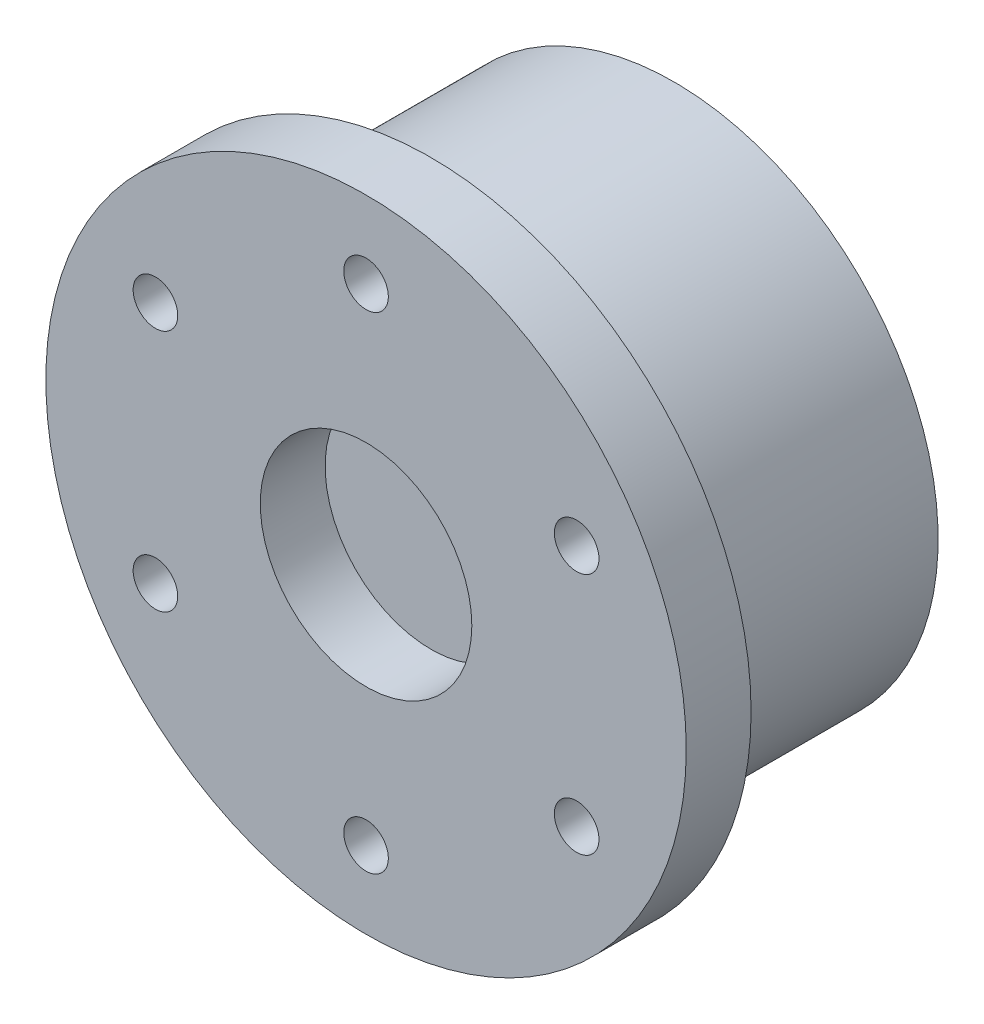
ISO-10303-21;
HEADER;
FILE_DESCRIPTION(('STEP AP214'),'2;1');
FILE_NAME('part.step','',(''),(''),'','','');
FILE_SCHEMA(('AUTOMOTIVE_DESIGN { 1 0 10303 214 1 1 1 1 }'));
ENDSEC;
DATA;
#1=APPLICATION_CONTEXT('core data for automotive mechanical design processes');
#2=APPLICATION_PROTOCOL_DEFINITION('international standard','automotive_design',2000,#1);
#3=PRODUCT_CONTEXT('',#1,'mechanical');
#4=PRODUCT('Part','Part','',(#3));
#5=PRODUCT_RELATED_PRODUCT_CATEGORY('part','',(#4));
#6=PRODUCT_DEFINITION_FORMATION('','',#4);
#7=PRODUCT_DEFINITION_CONTEXT('part definition',#1,'design');
#8=PRODUCT_DEFINITION('design','',#6,#7);
#9=PRODUCT_DEFINITION_SHAPE('','',#8);
#10=(LENGTH_UNIT() NAMED_UNIT(*) SI_UNIT(.MILLI.,.METRE.));
#11=(NAMED_UNIT(*) PLANE_ANGLE_UNIT() SI_UNIT($,.RADIAN.));
#12=(NAMED_UNIT(*) SI_UNIT($,.STERADIAN.) SOLID_ANGLE_UNIT());
#13=UNCERTAINTY_MEASURE_WITH_UNIT(LENGTH_MEASURE(1.E-05),#10,'distance_accuracy_value','');
#14=(GEOMETRIC_REPRESENTATION_CONTEXT(3) GLOBAL_UNCERTAINTY_ASSIGNED_CONTEXT((#13)) GLOBAL_UNIT_ASSIGNED_CONTEXT((#10,
#11,#12)) REPRESENTATION_CONTEXT('',''));
#15=CARTESIAN_POINT('',(0.,0.,0.));
#16=DIRECTION('',(0.,0.,1.));
#17=DIRECTION('',(1.,0.,0.));
#18=AXIS2_PLACEMENT_3D('',#15,#16,#17);
#19=CARTESIAN_POINT('',(0.,0.,-8.));
#20=DIRECTION('',(0.,0.,1.));
#21=DIRECTION('',(1.,0.,0.));
#22=AXIS2_PLACEMENT_3D('',#19,#20,#21);
#23=CYLINDRICAL_SURFACE('',#22,39.5);
#24=CARTESIAN_POINT('',(0.,0.,-8.));
#25=DIRECTION('',(0.,0.,1.));
#26=DIRECTION('',(1.,0.,0.));
#27=AXIS2_PLACEMENT_3D('',#24,#25,#26);
#28=CIRCLE('',#27,39.5);
#29=CARTESIAN_POINT('',(39.5,0.,-8.));
#30=VERTEX_POINT('',#29);
#31=EDGE_CURVE('E43',#30,#30,#28,.T.);
#32=ORIENTED_EDGE('',*,*,#31,.T.);
#33=EDGE_LOOP('',(#32));
#34=FACE_BOUND('',#33,.T.);
#35=CARTESIAN_POINT('',(0.,0.,0.));
#36=DIRECTION('',(0.,0.,1.));
#37=DIRECTION('',(1.,0.,0.));
#38=AXIS2_PLACEMENT_3D('',#35,#36,#37);
#39=CIRCLE('',#38,39.5);
#40=CARTESIAN_POINT('',(39.5,0.,0.));
#41=VERTEX_POINT('',#40);
#42=EDGE_CURVE('E39',#41,#41,#39,.T.);
#43=ORIENTED_EDGE('',*,*,#42,.F.);
#44=EDGE_LOOP('',(#43));
#45=FACE_BOUND('',#44,.T.);
#46=ADVANCED_FACE('F36',(#34,#45),#23,.T.);
#47=CARTESIAN_POINT('',(0.,0.,-8.));
#48=DIRECTION('',(0.,0.,1.));
#49=DIRECTION('',(1.,0.,0.));
#50=AXIS2_PLACEMENT_3D('',#47,#48,#49);
#51=PLANE('',#50);
#52=CARTESIAN_POINT('',(0.,0.,-8.));
#53=DIRECTION('',(0.,0.,-1.));
#54=DIRECTION('',(-1.,0.,0.));
#55=AXIS2_PLACEMENT_3D('',#52,#53,#54);
#56=CIRCLE('',#55,32.575);
#57=CARTESIAN_POINT('',(-32.575,0.,-8.));
#58=VERTEX_POINT('',#57);
#59=EDGE_CURVE('E11',#58,#58,#56,.T.);
#60=ORIENTED_EDGE('',*,*,#59,.F.);
#61=EDGE_LOOP('',(#60));
#62=FACE_BOUND('',#61,.T.);
#63=ORIENTED_EDGE('',*,*,#31,.F.);
#64=EDGE_LOOP('',(#63));
#65=FACE_BOUND('',#64,.T.);
#66=ADVANCED_FACE('F143',(#62,#65),#51,.F.);
#67=CARTESIAN_POINT('',(0.,0.,0.));
#68=DIRECTION('',(0.,0.,1.));
#69=DIRECTION('',(1.,0.,0.));
#70=AXIS2_PLACEMENT_3D('',#67,#68,#69);
#71=PLANE('',#70);
#72=CARTESIAN_POINT('',(0.,30.,0.));
#73=DIRECTION('',(0.,0.,1.));
#74=DIRECTION('',(1.,0.,0.));
#75=AXIS2_PLACEMENT_3D('',#72,#73,#74);
#76=CIRCLE('',#75,2.75);
#77=CARTESIAN_POINT('',(2.75,30.,0.));
#78=VERTEX_POINT('',#77);
#79=EDGE_CURVE('E110',#78,#78,#76,.T.);
#80=ORIENTED_EDGE('',*,*,#79,.F.);
#81=EDGE_LOOP('',(#80));
#82=FACE_BOUND('',#81,.T.);
#83=CARTESIAN_POINT('',(-25.9807621135313,-15.0000000000011,0.));
#84=DIRECTION('',(0.,0.,1.));
#85=DIRECTION('',(1.,0.,0.));
#86=AXIS2_PLACEMENT_3D('',#83,#84,#85);
#87=CIRCLE('',#86,2.75);
#88=CARTESIAN_POINT('',(-23.2307621135313,-15.0000000000011,0.));
#89=VERTEX_POINT('',#88);
#90=EDGE_CURVE('E116',#89,#89,#87,.T.);
#91=ORIENTED_EDGE('',*,*,#90,.F.);
#92=EDGE_LOOP('',(#91));
#93=FACE_BOUND('',#92,.T.);
#94=CARTESIAN_POINT('',(2.41976912318671E-12,-30.,0.));
#95=DIRECTION('',(0.,0.,1.));
#96=DIRECTION('',(1.,0.,0.));
#97=AXIS2_PLACEMENT_3D('',#94,#95,#96);
#98=CIRCLE('',#97,2.75);
#99=CARTESIAN_POINT('',(2.75000000000242,-30.,0.));
#100=VERTEX_POINT('',#99);
#101=EDGE_CURVE('E122',#100,#100,#98,.T.);
#102=ORIENTED_EDGE('',*,*,#101,.F.);
#103=EDGE_LOOP('',(#102));
#104=FACE_BOUND('',#103,.T.);
#105=CARTESIAN_POINT('',(25.980762113535,-14.9999999999989,0.));
#106=DIRECTION('',(0.,0.,1.));
#107=DIRECTION('',(1.,0.,0.));
#108=AXIS2_PLACEMENT_3D('',#105,#106,#107);
#109=CIRCLE('',#108,2.75);
#110=CARTESIAN_POINT('',(28.730762113535,-14.9999999999989,0.));
#111=VERTEX_POINT('',#110);
#112=EDGE_CURVE('E128',#111,#111,#109,.T.);
#113=ORIENTED_EDGE('',*,*,#112,.F.);
#114=EDGE_LOOP('',(#113));
#115=FACE_BOUND('',#114,.T.);
#116=CARTESIAN_POINT('',(25.9807621135338,15.0000000000011,0.));
#117=DIRECTION('',(0.,0.,1.));
#118=DIRECTION('',(1.,0.,0.));
#119=AXIS2_PLACEMENT_3D('',#116,#117,#118);
#120=CIRCLE('',#119,2.75);
#121=CARTESIAN_POINT('',(28.7307621135338,15.0000000000011,0.));
#122=VERTEX_POINT('',#121);
#123=EDGE_CURVE('E104',#122,#122,#120,.T.);
#124=ORIENTED_EDGE('',*,*,#123,.F.);
#125=EDGE_LOOP('',(#124));
#126=FACE_BOUND('',#125,.T.);
#127=CARTESIAN_POINT('',(-25.9807621135326,14.9999999999989,0.));
#128=DIRECTION('',(0.,0.,1.));
#129=DIRECTION('',(1.,0.,0.));
#130=AXIS2_PLACEMENT_3D('',#127,#128,#129);
#131=CIRCLE('',#130,2.75);
#132=CARTESIAN_POINT('',(-23.2307621135326,14.9999999999989,0.));
#133=VERTEX_POINT('',#132);
#134=EDGE_CURVE('E101',#133,#133,#131,.T.);
#135=ORIENTED_EDGE('',*,*,#134,.F.);
#136=EDGE_LOOP('',(#135));
#137=FACE_BOUND('',#136,.T.);
#138=CARTESIAN_POINT('',(0.,0.,0.));
#139=DIRECTION('',(0.,0.,1.));
#140=DIRECTION('',(1.,0.,0.));
#141=AXIS2_PLACEMENT_3D('',#138,#139,#140);
#142=CIRCLE('',#141,13.05);
#143=CARTESIAN_POINT('',(13.05,0.,0.));
#144=VERTEX_POINT('',#143);
#145=EDGE_CURVE('E55',#144,#144,#142,.T.);
#146=ORIENTED_EDGE('',*,*,#145,.F.);
#147=EDGE_LOOP('',(#146));
#148=FACE_BOUND('',#147,.T.);
#149=ORIENTED_EDGE('',*,*,#42,.T.);
#150=EDGE_LOOP('',(#149));
#151=FACE_BOUND('',#150,.T.);
#152=ADVANCED_FACE('F139',(#82,#93,#104,#115,#126,#137,#148,#151),#71,.T.);
#153=CARTESIAN_POINT('',(0.,0.,-8.));
#154=DIRECTION('',(0.,0.,1.));
#155=DIRECTION('',(1.,0.,0.));
#156=AXIS2_PLACEMENT_3D('',#153,#154,#155);
#157=CYLINDRICAL_SURFACE('',#156,13.05);
#158=CARTESIAN_POINT('',(0.,0.,-8.));
#159=DIRECTION('',(0.,0.,1.));
#160=DIRECTION('',(1.,0.,0.));
#161=AXIS2_PLACEMENT_3D('',#158,#159,#160);
#162=CIRCLE('',#161,13.05);
#163=CARTESIAN_POINT('',(13.05,0.,-8.));
#164=VERTEX_POINT('',#163);
#165=EDGE_CURVE('E52',#164,#164,#162,.T.);
#166=ORIENTED_EDGE('',*,*,#165,.F.);
#167=EDGE_LOOP('',(#166));
#168=FACE_BOUND('',#167,.T.);
#169=ORIENTED_EDGE('',*,*,#145,.T.);
#170=EDGE_LOOP('',(#169));
#171=FACE_BOUND('',#170,.T.);
#172=ADVANCED_FACE('F142',(#168,#171),#157,.F.);
#173=CARTESIAN_POINT('',(21.6506350946104,12.4999999999991,-38.));
#174=DIRECTION('',(0.,0.,1.));
#175=DIRECTION('',(1.,0.,0.));
#176=AXIS2_PLACEMENT_3D('',#173,#174,#175);
#177=CYLINDRICAL_SURFACE('',#176,2.55000000000107);
#178=CARTESIAN_POINT('',(21.6506350946104,12.4999999999991,-38.));
#179=DIRECTION('',(0.,0.,-1.));
#180=DIRECTION('',(-1.,0.,0.));
#181=AXIS2_PLACEMENT_3D('',#178,#179,#180);
#182=CIRCLE('',#181,2.55000000000107);
#183=CARTESIAN_POINT('',(19.1006350946094,12.4999999999991,-38.));
#184=VERTEX_POINT('',#183);
#185=EDGE_CURVE('E92',#184,#184,#182,.T.);
#186=ORIENTED_EDGE('',*,*,#185,.T.);
#187=EDGE_LOOP('',(#186));
#188=FACE_BOUND('',#187,.T.);
#189=CARTESIAN_POINT('',(21.6506350946104,12.4999999999991,-8.));
#190=DIRECTION('',(0.,0.,-1.));
#191=DIRECTION('',(-1.,0.,0.));
#192=AXIS2_PLACEMENT_3D('',#189,#190,#191);
#193=CIRCLE('',#192,2.55000000000107);
#194=CARTESIAN_POINT('',(19.1006350946094,12.4999999999991,-8.));
#195=VERTEX_POINT('',#194);
#196=EDGE_CURVE('E95',#195,#195,#193,.T.);
#197=ORIENTED_EDGE('',*,*,#196,.F.);
#198=EDGE_LOOP('',(#197));
#199=FACE_BOUND('',#198,.T.);
#200=ADVANCED_FACE('F200',(#188,#199),#177,.F.);
#201=CARTESIAN_POINT('',(21.6506350946094,-12.5000000000009,-38.));
#202=DIRECTION('',(0.,0.,1.));
#203=DIRECTION('',(1.,0.,0.));
#204=AXIS2_PLACEMENT_3D('',#201,#202,#203);
#205=CYLINDRICAL_SURFACE('',#204,2.55000000000202);
#206=CARTESIAN_POINT('',(21.6506350946094,-12.5000000000009,-38.));
#207=DIRECTION('',(0.,0.,-1.));
#208=DIRECTION('',(-1.,0.,0.));
#209=AXIS2_PLACEMENT_3D('',#206,#207,#208);
#210=CIRCLE('',#209,2.55000000000202);
#211=CARTESIAN_POINT('',(19.1006350946074,-12.5000000000009,-38.));
#212=VERTEX_POINT('',#211);
#213=EDGE_CURVE('E86',#212,#212,#210,.T.);
#214=ORIENTED_EDGE('',*,*,#213,.T.);
#215=EDGE_LOOP('',(#214));
#216=FACE_BOUND('',#215,.T.);
#217=CARTESIAN_POINT('',(21.6506350946094,-12.5000000000009,-8.));
#218=DIRECTION('',(0.,0.,-1.));
#219=DIRECTION('',(-1.,0.,0.));
#220=AXIS2_PLACEMENT_3D('',#217,#218,#219);
#221=CIRCLE('',#220,2.55000000000202);
#222=CARTESIAN_POINT('',(19.1006350946074,-12.5000000000009,-8.));
#223=VERTEX_POINT('',#222);
#224=EDGE_CURVE('E89',#223,#223,#221,.T.);
#225=ORIENTED_EDGE('',*,*,#224,.F.);
#226=EDGE_LOOP('',(#225));
#227=FACE_BOUND('',#226,.T.);
#228=ADVANCED_FACE('F197',(#216,#227),#205,.F.);
#229=CARTESIAN_POINT('',(-2.1224433562867E-12,-25.,-38.));
#230=DIRECTION('',(0.,0.,1.));
#231=DIRECTION('',(1.,0.,0.));
#232=AXIS2_PLACEMENT_3D('',#229,#230,#231);
#233=CYLINDRICAL_SURFACE('',#232,2.5500000000022);
#234=CARTESIAN_POINT('',(-2.1224433562867E-12,-25.,-38.));
#235=DIRECTION('',(0.,0.,-1.));
#236=DIRECTION('',(-1.,0.,0.));
#237=AXIS2_PLACEMENT_3D('',#234,#235,#236);
#238=CIRCLE('',#237,2.5500000000022);
#239=CARTESIAN_POINT('',(-2.55000000000432,-25.,-38.));
#240=VERTEX_POINT('',#239);
#241=EDGE_CURVE('E80',#240,#240,#238,.T.);
#242=ORIENTED_EDGE('',*,*,#241,.T.);
#243=EDGE_LOOP('',(#242));
#244=FACE_BOUND('',#243,.T.);
#245=CARTESIAN_POINT('',(-2.1224433562867E-12,-25.,-8.));
#246=DIRECTION('',(0.,0.,-1.));
#247=DIRECTION('',(-1.,0.,0.));
#248=AXIS2_PLACEMENT_3D('',#245,#246,#247);
#249=CIRCLE('',#248,2.5500000000022);
#250=CARTESIAN_POINT('',(-2.55000000000432,-25.,-8.));
#251=VERTEX_POINT('',#250);
#252=EDGE_CURVE('E83',#251,#251,#249,.T.);
#253=ORIENTED_EDGE('',*,*,#252,.F.);
#254=EDGE_LOOP('',(#253));
#255=FACE_BOUND('',#254,.T.);
#256=ADVANCED_FACE('F199',(#244,#255),#233,.F.);
#257=CARTESIAN_POINT('',(-21.6506350946126,-12.4999999999991,-38.));
#258=DIRECTION('',(0.,0.,1.));
#259=DIRECTION('',(1.,0.,0.));
#260=AXIS2_PLACEMENT_3D('',#257,#258,#259);
#261=CYLINDRICAL_SURFACE('',#260,2.55000000000137);
#262=CARTESIAN_POINT('',(-21.6506350946126,-12.4999999999991,-38.));
#263=DIRECTION('',(0.,0.,-1.));
#264=DIRECTION('',(-1.,0.,0.));
#265=AXIS2_PLACEMENT_3D('',#262,#263,#264);
#266=CIRCLE('',#265,2.55000000000137);
#267=CARTESIAN_POINT('',(-24.2006350946139,-12.4999999999991,-38.));
#268=VERTEX_POINT('',#267);
#269=EDGE_CURVE('E74',#268,#268,#266,.T.);
#270=ORIENTED_EDGE('',*,*,#269,.T.);
#271=EDGE_LOOP('',(#270));
#272=FACE_BOUND('',#271,.T.);
#273=CARTESIAN_POINT('',(-21.6506350946126,-12.4999999999991,-8.));
#274=DIRECTION('',(0.,0.,-1.));
#275=DIRECTION('',(-1.,0.,0.));
#276=AXIS2_PLACEMENT_3D('',#273,#274,#275);
#277=CIRCLE('',#276,2.55000000000137);
#278=CARTESIAN_POINT('',(-24.2006350946139,-12.4999999999991,-8.));
#279=VERTEX_POINT('',#278);
#280=EDGE_CURVE('E77',#279,#279,#277,.T.);
#281=ORIENTED_EDGE('',*,*,#280,.F.);
#282=EDGE_LOOP('',(#281));
#283=FACE_BOUND('',#282,.T.);
#284=ADVANCED_FACE('F207',(#272,#283),#261,.F.);
#285=CARTESIAN_POINT('',(-21.6506350946115,12.5000000000009,-38.));
#286=DIRECTION('',(0.,0.,1.));
#287=DIRECTION('',(1.,0.,0.));
#288=AXIS2_PLACEMENT_3D('',#285,#286,#287);
#289=CYLINDRICAL_SURFACE('',#288,2.5500000000003);
#290=CARTESIAN_POINT('',(-21.6506350946115,12.5000000000009,-38.));
#291=DIRECTION('',(0.,0.,-1.));
#292=DIRECTION('',(-1.,0.,0.));
#293=AXIS2_PLACEMENT_3D('',#290,#291,#292);
#294=CIRCLE('',#293,2.5500000000003);
#295=CARTESIAN_POINT('',(-24.2006350946118,12.5000000000009,-38.));
#296=VERTEX_POINT('',#295);
#297=EDGE_CURVE('E69',#296,#296,#294,.T.);
#298=ORIENTED_EDGE('',*,*,#297,.T.);
#299=EDGE_LOOP('',(#298));
#300=FACE_BOUND('',#299,.T.);
#301=CARTESIAN_POINT('',(-21.6506350946115,12.5000000000009,-8.));
#302=DIRECTION('',(0.,0.,-1.));
#303=DIRECTION('',(-1.,0.,0.));
#304=AXIS2_PLACEMENT_3D('',#301,#302,#303);
#305=CIRCLE('',#304,2.5500000000003);
#306=CARTESIAN_POINT('',(-24.2006350946118,12.5000000000009,-8.));
#307=VERTEX_POINT('',#306);
#308=EDGE_CURVE('E71',#307,#307,#305,.T.);
#309=ORIENTED_EDGE('',*,*,#308,.F.);
#310=EDGE_LOOP('',(#309));
#311=FACE_BOUND('',#310,.T.);
#312=ADVANCED_FACE('F215',(#300,#311),#289,.F.);
#313=CARTESIAN_POINT('',(0.,25.,-38.));
#314=DIRECTION('',(0.,0.,1.));
#315=DIRECTION('',(1.,0.,0.));
#316=AXIS2_PLACEMENT_3D('',#313,#314,#315);
#317=CYLINDRICAL_SURFACE('',#316,2.55);
#318=CARTESIAN_POINT('',(0.,25.,-38.));
#319=DIRECTION('',(0.,0.,-1.));
#320=DIRECTION('',(-1.,0.,0.));
#321=AXIS2_PLACEMENT_3D('',#318,#319,#320);
#322=CIRCLE('',#321,2.55);
#323=CARTESIAN_POINT('',(-2.55,25.,-38.));
#324=VERTEX_POINT('',#323);
#325=EDGE_CURVE('E60',#324,#324,#322,.T.);
#326=ORIENTED_EDGE('',*,*,#325,.T.);
#327=EDGE_LOOP('',(#326));
#328=FACE_BOUND('',#327,.T.);
#329=CARTESIAN_POINT('',(0.,25.,-8.));
#330=DIRECTION('',(0.,0.,-1.));
#331=DIRECTION('',(-1.,0.,0.));
#332=AXIS2_PLACEMENT_3D('',#329,#330,#331);
#333=CIRCLE('',#332,2.55);
#334=CARTESIAN_POINT('',(-2.55,25.,-8.));
#335=VERTEX_POINT('',#334);
#336=EDGE_CURVE('E64',#335,#335,#333,.T.);
#337=ORIENTED_EDGE('',*,*,#336,.F.);
#338=EDGE_LOOP('',(#337));
#339=FACE_BOUND('',#338,.T.);
#340=ADVANCED_FACE('F219',(#328,#339),#317,.F.);
#341=CARTESIAN_POINT('',(0.,0.,-38.));
#342=DIRECTION('',(0.,0.,1.));
#343=DIRECTION('',(1.,0.,0.));
#344=AXIS2_PLACEMENT_3D('',#341,#342,#343);
#345=CYLINDRICAL_SURFACE('',#344,32.575);
#346=CARTESIAN_POINT('',(0.,0.,-38.));
#347=DIRECTION('',(0.,0.,-1.));
#348=DIRECTION('',(-1.,0.,0.));
#349=AXIS2_PLACEMENT_3D('',#346,#347,#348);
#350=CIRCLE('',#349,32.575);
#351=CARTESIAN_POINT('',(-32.575,0.,-38.));
#352=VERTEX_POINT('',#351);
#353=EDGE_CURVE('E50',#352,#352,#350,.T.);
#354=ORIENTED_EDGE('',*,*,#353,.F.);
#355=EDGE_LOOP('',(#354));
#356=FACE_BOUND('',#355,.T.);
#357=ORIENTED_EDGE('',*,*,#59,.T.);
#358=EDGE_LOOP('',(#357));
#359=FACE_BOUND('',#358,.T.);
#360=ADVANCED_FACE('F192',(#356,#359),#345,.T.);
#361=CARTESIAN_POINT('',(0.,0.,-38.));
#362=DIRECTION('',(0.,0.,-1.));
#363=DIRECTION('',(-1.,0.,0.));
#364=AXIS2_PLACEMENT_3D('',#361,#362,#363);
#365=PLANE('',#364);
#366=ORIENTED_EDGE('',*,*,#213,.F.);
#367=EDGE_LOOP('',(#366));
#368=FACE_BOUND('',#367,.T.);
#369=ORIENTED_EDGE('',*,*,#269,.F.);
#370=EDGE_LOOP('',(#369));
#371=FACE_BOUND('',#370,.T.);
#372=ORIENTED_EDGE('',*,*,#325,.F.);
#373=EDGE_LOOP('',(#372));
#374=FACE_BOUND('',#373,.T.);
#375=ORIENTED_EDGE('',*,*,#353,.T.);
#376=EDGE_LOOP('',(#375));
#377=FACE_BOUND('',#376,.T.);
#378=ORIENTED_EDGE('',*,*,#297,.F.);
#379=EDGE_LOOP('',(#378));
#380=FACE_BOUND('',#379,.T.);
#381=ORIENTED_EDGE('',*,*,#241,.F.);
#382=EDGE_LOOP('',(#381));
#383=FACE_BOUND('',#382,.T.);
#384=ORIENTED_EDGE('',*,*,#185,.F.);
#385=EDGE_LOOP('',(#384));
#386=FACE_BOUND('',#385,.T.);
#387=ADVANCED_FACE('F184',(#368,#371,#374,#377,#380,#383,#386),#365,.T.);
#388=ORIENTED_EDGE('',*,*,#224,.T.);
#389=EDGE_LOOP('',(#388));
#390=FACE_BOUND('',#389,.T.);
#391=ADVANCED_FACE('F172',(#390),#51,.F.);
#392=ORIENTED_EDGE('',*,*,#252,.T.);
#393=EDGE_LOOP('',(#392));
#394=FACE_BOUND('',#393,.T.);
#395=ADVANCED_FACE('F183',(#394),#51,.F.);
#396=ORIENTED_EDGE('',*,*,#280,.T.);
#397=EDGE_LOOP('',(#396));
#398=FACE_BOUND('',#397,.T.);
#399=ADVANCED_FACE('F190',(#398),#51,.F.);
#400=ORIENTED_EDGE('',*,*,#308,.T.);
#401=EDGE_LOOP('',(#400));
#402=FACE_BOUND('',#401,.T.);
#403=ADVANCED_FACE('F167',(#402),#51,.F.);
#404=ORIENTED_EDGE('',*,*,#336,.T.);
#405=EDGE_LOOP('',(#404));
#406=FACE_BOUND('',#405,.T.);
#407=ADVANCED_FACE('F158',(#406),#51,.F.);
#408=CARTESIAN_POINT('',(0.,0.,-8.));
#409=DIRECTION('',(0.,0.,-1.));
#410=DIRECTION('',(-1.,0.,0.));
#411=AXIS2_PLACEMENT_3D('',#408,#409,#410);
#412=PLANE('',#411);
#413=ORIENTED_EDGE('',*,*,#165,.T.);
#414=EDGE_LOOP('',(#413));
#415=FACE_BOUND('',#414,.T.);
#416=ADVANCED_FACE('F166',(#415),#412,.F.);
#417=ORIENTED_EDGE('',*,*,#196,.T.);
#418=EDGE_LOOP('',(#417));
#419=FACE_BOUND('',#418,.T.);
#420=ADVANCED_FACE('F159',(#419),#51,.F.);
#421=CARTESIAN_POINT('',(-25.9807621135326,14.9999999999989,-7.));
#422=DIRECTION('',(0.,0.,1.));
#423=DIRECTION('',(1.,0.,0.));
#424=AXIS2_PLACEMENT_3D('',#421,#422,#423);
#425=CYLINDRICAL_SURFACE('',#424,2.75);
#426=CARTESIAN_POINT('',(-25.9807621135326,14.9999999999989,-7.));
#427=DIRECTION('',(0.,0.,1.));
#428=DIRECTION('',(1.,0.,0.));
#429=AXIS2_PLACEMENT_3D('',#426,#427,#428);
#430=CIRCLE('',#429,2.75);
#431=CARTESIAN_POINT('',(-23.2307621135326,14.9999999999989,-7.));
#432=VERTEX_POINT('',#431);
#433=EDGE_CURVE('E98',#432,#432,#430,.T.);
#434=ORIENTED_EDGE('',*,*,#433,.F.);
#435=EDGE_LOOP('',(#434));
#436=FACE_BOUND('',#435,.T.);
#437=ORIENTED_EDGE('',*,*,#134,.T.);
#438=EDGE_LOOP('',(#437));
#439=FACE_BOUND('',#438,.T.);
#440=ADVANCED_FACE('F170',(#436,#439),#425,.F.);
#441=CARTESIAN_POINT('',(0.,0.,-7.));
#442=DIRECTION('',(0.,0.,1.));
#443=DIRECTION('',(1.,0.,0.));
#444=AXIS2_PLACEMENT_3D('',#441,#442,#443);
#445=PLANE('',#444);
#446=ORIENTED_EDGE('',*,*,#433,.T.);
#447=EDGE_LOOP('',(#446));
#448=FACE_BOUND('',#447,.T.);
#449=ADVANCED_FACE('F177',(#448),#445,.T.);
#450=CARTESIAN_POINT('',(25.9807621135338,15.0000000000011,-7.));
#451=DIRECTION('',(0.,0.,1.));
#452=DIRECTION('',(1.,0.,0.));
#453=AXIS2_PLACEMENT_3D('',#450,#451,#452);
#454=CYLINDRICAL_SURFACE('',#453,2.75);
#455=CARTESIAN_POINT('',(25.9807621135338,15.0000000000011,-7.));
#456=DIRECTION('',(0.,0.,1.));
#457=DIRECTION('',(1.,0.,0.));
#458=AXIS2_PLACEMENT_3D('',#455,#456,#457);
#459=CIRCLE('',#458,2.75);
#460=CARTESIAN_POINT('',(28.7307621135338,15.0000000000011,-7.));
#461=VERTEX_POINT('',#460);
#462=EDGE_CURVE('E131',#461,#461,#459,.T.);
#463=ORIENTED_EDGE('',*,*,#462,.F.);
#464=EDGE_LOOP('',(#463));
#465=FACE_BOUND('',#464,.T.);
#466=ORIENTED_EDGE('',*,*,#123,.T.);
#467=EDGE_LOOP('',(#466));
#468=FACE_BOUND('',#467,.T.);
#469=ADVANCED_FACE('F137',(#465,#468),#454,.F.);
#470=CARTESIAN_POINT('',(0.,0.,-7.));
#471=DIRECTION('',(0.,0.,1.));
#472=DIRECTION('',(1.,0.,0.));
#473=AXIS2_PLACEMENT_3D('',#470,#471,#472);
#474=PLANE('',#473);
#475=ORIENTED_EDGE('',*,*,#462,.T.);
#476=EDGE_LOOP('',(#475));
#477=FACE_BOUND('',#476,.T.);
#478=ADVANCED_FACE('F348',(#477),#474,.T.);
#479=CARTESIAN_POINT('',(25.980762113535,-14.9999999999989,-7.));
#480=DIRECTION('',(0.,0.,1.));
#481=DIRECTION('',(1.,0.,0.));
#482=AXIS2_PLACEMENT_3D('',#479,#480,#481);
#483=CYLINDRICAL_SURFACE('',#482,2.75);
#484=CARTESIAN_POINT('',(25.980762113535,-14.9999999999989,-7.));
#485=DIRECTION('',(0.,0.,1.));
#486=DIRECTION('',(1.,0.,0.));
#487=AXIS2_PLACEMENT_3D('',#484,#485,#486);
#488=CIRCLE('',#487,2.75);
#489=CARTESIAN_POINT('',(28.730762113535,-14.9999999999989,-7.));
#490=VERTEX_POINT('',#489);
#491=EDGE_CURVE('E125',#490,#490,#488,.T.);
#492=ORIENTED_EDGE('',*,*,#491,.F.);
#493=EDGE_LOOP('',(#492));
#494=FACE_BOUND('',#493,.T.);
#495=ORIENTED_EDGE('',*,*,#112,.T.);
#496=EDGE_LOOP('',(#495));
#497=FACE_BOUND('',#496,.T.);
#498=ADVANCED_FACE('F358',(#494,#497),#483,.F.);
#499=CARTESIAN_POINT('',(0.,0.,-7.));
#500=DIRECTION('',(0.,0.,1.));
#501=DIRECTION('',(1.,0.,0.));
#502=AXIS2_PLACEMENT_3D('',#499,#500,#501);
#503=PLANE('',#502);
#504=ORIENTED_EDGE('',*,*,#491,.T.);
#505=EDGE_LOOP('',(#504));
#506=FACE_BOUND('',#505,.T.);
#507=ADVANCED_FACE('F368',(#506),#503,.T.);
#508=CARTESIAN_POINT('',(2.41976912318671E-12,-30.,-7.));
#509=DIRECTION('',(0.,0.,1.));
#510=DIRECTION('',(1.,0.,0.));
#511=AXIS2_PLACEMENT_3D('',#508,#509,#510);
#512=CYLINDRICAL_SURFACE('',#511,2.75);
#513=CARTESIAN_POINT('',(2.41976912318671E-12,-30.,-7.));
#514=DIRECTION('',(0.,0.,1.));
#515=DIRECTION('',(1.,0.,0.));
#516=AXIS2_PLACEMENT_3D('',#513,#514,#515);
#517=CIRCLE('',#516,2.75);
#518=CARTESIAN_POINT('',(2.75000000000242,-30.,-7.));
#519=VERTEX_POINT('',#518);
#520=EDGE_CURVE('E119',#519,#519,#517,.T.);
#521=ORIENTED_EDGE('',*,*,#520,.F.);
#522=EDGE_LOOP('',(#521));
#523=FACE_BOUND('',#522,.T.);
#524=ORIENTED_EDGE('',*,*,#101,.T.);
#525=EDGE_LOOP('',(#524));
#526=FACE_BOUND('',#525,.T.);
#527=ADVANCED_FACE('F378',(#523,#526),#512,.F.);
#528=CARTESIAN_POINT('',(0.,0.,-7.));
#529=DIRECTION('',(0.,0.,1.));
#530=DIRECTION('',(1.,0.,0.));
#531=AXIS2_PLACEMENT_3D('',#528,#529,#530);
#532=PLANE('',#531);
#533=ORIENTED_EDGE('',*,*,#520,.T.);
#534=EDGE_LOOP('',(#533));
#535=FACE_BOUND('',#534,.T.);
#536=ADVANCED_FACE('F388',(#535),#532,.T.);
#537=CARTESIAN_POINT('',(-25.9807621135313,-15.0000000000011,-7.));
#538=DIRECTION('',(0.,0.,1.));
#539=DIRECTION('',(1.,0.,0.));
#540=AXIS2_PLACEMENT_3D('',#537,#538,#539);
#541=CYLINDRICAL_SURFACE('',#540,2.75);
#542=CARTESIAN_POINT('',(-25.9807621135313,-15.0000000000011,-7.));
#543=DIRECTION('',(0.,0.,1.));
#544=DIRECTION('',(1.,0.,0.));
#545=AXIS2_PLACEMENT_3D('',#542,#543,#544);
#546=CIRCLE('',#545,2.75);
#547=CARTESIAN_POINT('',(-23.2307621135313,-15.0000000000011,-7.));
#548=VERTEX_POINT('',#547);
#549=EDGE_CURVE('E113',#548,#548,#546,.T.);
#550=ORIENTED_EDGE('',*,*,#549,.F.);
#551=EDGE_LOOP('',(#550));
#552=FACE_BOUND('',#551,.T.);
#553=ORIENTED_EDGE('',*,*,#90,.T.);
#554=EDGE_LOOP('',(#553));
#555=FACE_BOUND('',#554,.T.);
#556=ADVANCED_FACE('F398',(#552,#555),#541,.F.);
#557=CARTESIAN_POINT('',(0.,0.,-7.));
#558=DIRECTION('',(0.,0.,1.));
#559=DIRECTION('',(1.,0.,0.));
#560=AXIS2_PLACEMENT_3D('',#557,#558,#559);
#561=PLANE('',#560);
#562=ORIENTED_EDGE('',*,*,#549,.T.);
#563=EDGE_LOOP('',(#562));
#564=FACE_BOUND('',#563,.T.);
#565=ADVANCED_FACE('F408',(#564),#561,.T.);
#566=CARTESIAN_POINT('',(0.,30.,-7.));
#567=DIRECTION('',(0.,0.,1.));
#568=DIRECTION('',(1.,0.,0.));
#569=AXIS2_PLACEMENT_3D('',#566,#567,#568);
#570=CYLINDRICAL_SURFACE('',#569,2.75);
#571=CARTESIAN_POINT('',(0.,30.,-7.));
#572=DIRECTION('',(0.,0.,1.));
#573=DIRECTION('',(1.,0.,0.));
#574=AXIS2_PLACEMENT_3D('',#571,#572,#573);
#575=CIRCLE('',#574,2.75);
#576=CARTESIAN_POINT('',(2.75,30.,-7.));
#577=VERTEX_POINT('',#576);
#578=EDGE_CURVE('E107',#577,#577,#575,.T.);
#579=ORIENTED_EDGE('',*,*,#578,.F.);
#580=EDGE_LOOP('',(#579));
#581=FACE_BOUND('',#580,.T.);
#582=ORIENTED_EDGE('',*,*,#79,.T.);
#583=EDGE_LOOP('',(#582));
#584=FACE_BOUND('',#583,.T.);
#585=ADVANCED_FACE('F418',(#581,#584),#570,.F.);
#586=CARTESIAN_POINT('',(0.,30.,-7.));
#587=DIRECTION('',(0.,0.,1.));
#588=DIRECTION('',(1.,0.,0.));
#589=AXIS2_PLACEMENT_3D('',#586,#587,#588);
#590=PLANE('',#589);
#591=ORIENTED_EDGE('',*,*,#578,.T.);
#592=EDGE_LOOP('',(#591));
#593=FACE_BOUND('',#592,.T.);
#594=ADVANCED_FACE('F428',(#593),#590,.T.);
#595=CLOSED_SHELL('',(#46,#66,#152,#172,#200,#228,#256,#284,#312,#340,#360,#387,#391,#395,#399,
#403,#407,#416,#420,#440,#449,#469,#478,#498,#507,#527,#536,#556,#565,#585,#594));
#596=MANIFOLD_SOLID_BREP('B2',#595);
#597=ADVANCED_BREP_SHAPE_REPRESENTATION('',(#18,#596),#14);
#598=SHAPE_DEFINITION_REPRESENTATION(#9,#597);
ENDSEC;
END-ISO-10303-21;
